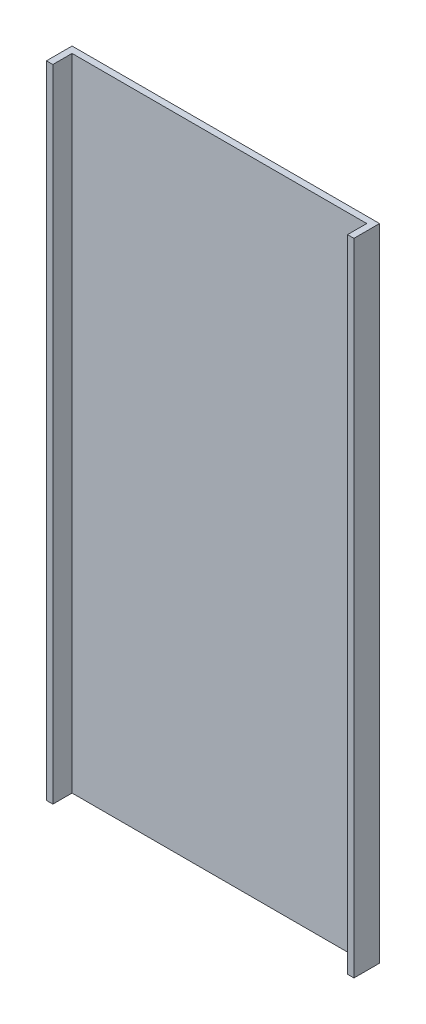
ISO-10303-21;
HEADER;
FILE_DESCRIPTION(('STEP AP214'),'2;1');
FILE_NAME('part.step','',(''),(''),'','','');
FILE_SCHEMA(('AUTOMOTIVE_DESIGN { 1 0 10303 214 1 1 1 1 }'));
ENDSEC;
DATA;
#1=APPLICATION_CONTEXT('core data for automotive mechanical design processes');
#2=APPLICATION_PROTOCOL_DEFINITION('international standard','automotive_design',2000,#1);
#3=PRODUCT_CONTEXT('',#1,'mechanical');
#4=PRODUCT('Part','Part','',(#3));
#5=PRODUCT_RELATED_PRODUCT_CATEGORY('part','',(#4));
#6=PRODUCT_DEFINITION_FORMATION('','',#4);
#7=PRODUCT_DEFINITION_CONTEXT('part definition',#1,'design');
#8=PRODUCT_DEFINITION('design','',#6,#7);
#9=PRODUCT_DEFINITION_SHAPE('','',#8);
#10=(LENGTH_UNIT() NAMED_UNIT(*) SI_UNIT(.MILLI.,.METRE.));
#11=(NAMED_UNIT(*) PLANE_ANGLE_UNIT() SI_UNIT($,.RADIAN.));
#12=(NAMED_UNIT(*) SI_UNIT($,.STERADIAN.) SOLID_ANGLE_UNIT());
#13=UNCERTAINTY_MEASURE_WITH_UNIT(LENGTH_MEASURE(1.E-05),#10,'distance_accuracy_value','');
#14=(GEOMETRIC_REPRESENTATION_CONTEXT(3) GLOBAL_UNCERTAINTY_ASSIGNED_CONTEXT((#13)) GLOBAL_UNIT_ASSIGNED_CONTEXT((#10,
#11,#12)) REPRESENTATION_CONTEXT('',''));
#15=CARTESIAN_POINT('',(0.,0.,0.));
#16=DIRECTION('',(0.,0.,1.));
#17=DIRECTION('',(1.,0.,0.));
#18=AXIS2_PLACEMENT_3D('',#15,#16,#17);
#19=CARTESIAN_POINT('',(0.,1000.,-40.));
#20=DIRECTION('',(1.,0.,0.));
#21=DIRECTION('',(0.,0.,-1.));
#22=AXIS2_PLACEMENT_3D('',#19,#20,#21);
#23=PLANE('',#22);
#24=DIRECTION('',(0.,0.,1.));
#25=VECTOR('',#24,1.);
#26=CARTESIAN_POINT('',(0.,0.,-40.));
#27=LINE('',#26,#25);
#28=CARTESIAN_POINT('',(0.,0.,-40.));
#29=VERTEX_POINT('',#28);
#30=CARTESIAN_POINT('',(0.,0.,0.));
#31=VERTEX_POINT('',#30);
#32=EDGE_CURVE('E140',#29,#31,#27,.T.);
#33=ORIENTED_EDGE('',*,*,#32,.T.);
#34=DIRECTION('',(0.,-1.,0.));
#35=VECTOR('',#34,1.);
#36=CARTESIAN_POINT('',(0.,1000.,0.));
#37=LINE('',#36,#35);
#38=CARTESIAN_POINT('',(0.,1000.,0.));
#39=VERTEX_POINT('',#38);
#40=EDGE_CURVE('E11',#39,#31,#37,.T.);
#41=ORIENTED_EDGE('',*,*,#40,.F.);
#42=DIRECTION('',(0.,0.,1.));
#43=VECTOR('',#42,1.);
#44=CARTESIAN_POINT('',(0.,1000.,-40.));
#45=LINE('',#44,#43);
#46=CARTESIAN_POINT('',(0.,1000.,-40.));
#47=VERTEX_POINT('',#46);
#48=EDGE_CURVE('E162',#47,#39,#45,.T.);
#49=ORIENTED_EDGE('',*,*,#48,.F.);
#50=DIRECTION('',(0.,-1.,0.));
#51=VECTOR('',#50,1.);
#52=CARTESIAN_POINT('',(0.,1000.,-40.));
#53=LINE('',#52,#51);
#54=EDGE_CURVE('E136',#47,#29,#53,.T.);
#55=ORIENTED_EDGE('',*,*,#54,.T.);
#56=EDGE_LOOP('',(#33,#41,#49,#55));
#57=FACE_BOUND('',#56,.T.);
#58=ADVANCED_FACE('F39',(#57),#23,.F.);
#59=CARTESIAN_POINT('',(0.,1000.,0.));
#60=DIRECTION('',(0.,0.,-1.));
#61=DIRECTION('',(-1.,0.,0.));
#62=AXIS2_PLACEMENT_3D('',#59,#60,#61);
#63=PLANE('',#62);
#64=DIRECTION('',(1.,0.,0.));
#65=VECTOR('',#64,1.);
#66=CARTESIAN_POINT('',(0.,0.,0.));
#67=LINE('',#66,#65);
#68=CARTESIAN_POINT('',(10.,0.,0.));
#69=VERTEX_POINT('',#68);
#70=EDGE_CURVE('E144',#31,#69,#67,.T.);
#71=ORIENTED_EDGE('',*,*,#70,.T.);
#72=DIRECTION('',(0.,-1.,0.));
#73=VECTOR('',#72,1.);
#74=CARTESIAN_POINT('',(10.,1000.,0.));
#75=LINE('',#74,#73);
#76=CARTESIAN_POINT('',(10.,1000.,0.));
#77=VERTEX_POINT('',#76);
#78=EDGE_CURVE('E48',#77,#69,#75,.T.);
#79=ORIENTED_EDGE('',*,*,#78,.F.);
#80=DIRECTION('',(1.,0.,0.));
#81=VECTOR('',#80,1.);
#82=CARTESIAN_POINT('',(0.,1000.,0.));
#83=LINE('',#82,#81);
#84=EDGE_CURVE('E99',#39,#77,#83,.T.);
#85=ORIENTED_EDGE('',*,*,#84,.F.);
#86=ORIENTED_EDGE('',*,*,#40,.T.);
#87=EDGE_LOOP('',(#71,#79,#85,#86));
#88=FACE_BOUND('',#87,.T.);
#89=ADVANCED_FACE('F208',(#88),#63,.F.);
#90=CARTESIAN_POINT('',(10.,1000.,0.));
#91=DIRECTION('',(-1.,0.,0.));
#92=DIRECTION('',(0.,0.,1.));
#93=AXIS2_PLACEMENT_3D('',#90,#91,#92);
#94=PLANE('',#93);
#95=DIRECTION('',(0.,0.,-1.));
#96=VECTOR('',#95,1.);
#97=CARTESIAN_POINT('',(10.,0.,0.));
#98=LINE('',#97,#96);
#99=CARTESIAN_POINT('',(10.,0.,-30.));
#100=VERTEX_POINT('',#99);
#101=EDGE_CURVE('E147',#69,#100,#98,.T.);
#102=ORIENTED_EDGE('',*,*,#101,.T.);
#103=DIRECTION('',(0.,-1.,0.));
#104=VECTOR('',#103,1.);
#105=CARTESIAN_POINT('',(10.,1000.,-30.));
#106=LINE('',#105,#104);
#107=CARTESIAN_POINT('',(10.,1000.,-30.));
#108=VERTEX_POINT('',#107);
#109=EDGE_CURVE('E173',#108,#100,#106,.T.);
#110=ORIENTED_EDGE('',*,*,#109,.F.);
#111=DIRECTION('',(0.,0.,-1.));
#112=VECTOR('',#111,1.);
#113=CARTESIAN_POINT('',(10.,1000.,0.));
#114=LINE('',#113,#112);
#115=EDGE_CURVE('E183',#77,#108,#114,.T.);
#116=ORIENTED_EDGE('',*,*,#115,.F.);
#117=ORIENTED_EDGE('',*,*,#78,.T.);
#118=EDGE_LOOP('',(#102,#110,#116,#117));
#119=FACE_BOUND('',#118,.T.);
#120=ADVANCED_FACE('F181',(#119),#94,.F.);
#121=CARTESIAN_POINT('',(10.,1000.,-30.));
#122=DIRECTION('',(0.,0.,-1.));
#123=DIRECTION('',(-1.,0.,0.));
#124=AXIS2_PLACEMENT_3D('',#121,#122,#123);
#125=PLANE('',#124);
#126=DIRECTION('',(1.,0.,0.));
#127=VECTOR('',#126,1.);
#128=CARTESIAN_POINT('',(10.,0.,-30.));
#129=LINE('',#128,#127);
#130=CARTESIAN_POINT('',(470.,0.,-30.));
#131=VERTEX_POINT('',#130);
#132=EDGE_CURVE('E150',#100,#131,#129,.T.);
#133=ORIENTED_EDGE('',*,*,#132,.T.);
#134=DIRECTION('',(0.,-1.,0.));
#135=VECTOR('',#134,1.);
#136=CARTESIAN_POINT('',(470.,1000.,-30.));
#137=LINE('',#136,#135);
#138=CARTESIAN_POINT('',(470.,1000.,-30.));
#139=VERTEX_POINT('',#138);
#140=EDGE_CURVE('E169',#139,#131,#137,.T.);
#141=ORIENTED_EDGE('',*,*,#140,.F.);
#142=DIRECTION('',(1.,0.,0.));
#143=VECTOR('',#142,1.);
#144=CARTESIAN_POINT('',(10.,1000.,-30.));
#145=LINE('',#144,#143);
#146=EDGE_CURVE('E196',#108,#139,#145,.T.);
#147=ORIENTED_EDGE('',*,*,#146,.F.);
#148=ORIENTED_EDGE('',*,*,#109,.T.);
#149=EDGE_LOOP('',(#133,#141,#147,#148));
#150=FACE_BOUND('',#149,.T.);
#151=ADVANCED_FACE('F191',(#150),#125,.F.);
#152=CARTESIAN_POINT('',(470.,1000.,-30.));
#153=DIRECTION('',(1.,0.,0.));
#154=DIRECTION('',(0.,0.,-1.));
#155=AXIS2_PLACEMENT_3D('',#152,#153,#154);
#156=PLANE('',#155);
#157=DIRECTION('',(0.,0.,1.));
#158=VECTOR('',#157,1.);
#159=CARTESIAN_POINT('',(470.,0.,-30.));
#160=LINE('',#159,#158);
#161=CARTESIAN_POINT('',(470.,0.,0.));
#162=VERTEX_POINT('',#161);
#163=EDGE_CURVE('E153',#131,#162,#160,.T.);
#164=ORIENTED_EDGE('',*,*,#163,.T.);
#165=DIRECTION('',(0.,-1.,0.));
#166=VECTOR('',#165,1.);
#167=CARTESIAN_POINT('',(470.,1000.,0.));
#168=LINE('',#167,#166);
#169=CARTESIAN_POINT('',(470.,1000.,0.));
#170=VERTEX_POINT('',#169);
#171=EDGE_CURVE('E129',#170,#162,#168,.T.);
#172=ORIENTED_EDGE('',*,*,#171,.F.);
#173=DIRECTION('',(0.,0.,1.));
#174=VECTOR('',#173,1.);
#175=CARTESIAN_POINT('',(470.,1000.,-30.));
#176=LINE('',#175,#174);
#177=EDGE_CURVE('E118',#139,#170,#176,.T.);
#178=ORIENTED_EDGE('',*,*,#177,.F.);
#179=ORIENTED_EDGE('',*,*,#140,.T.);
#180=EDGE_LOOP('',(#164,#172,#178,#179));
#181=FACE_BOUND('',#180,.T.);
#182=ADVANCED_FACE('F194',(#181),#156,.F.);
#183=CARTESIAN_POINT('',(470.,1000.,0.));
#184=DIRECTION('',(0.,0.,-1.));
#185=DIRECTION('',(-1.,0.,0.));
#186=AXIS2_PLACEMENT_3D('',#183,#184,#185);
#187=PLANE('',#186);
#188=DIRECTION('',(1.,0.,0.));
#189=VECTOR('',#188,1.);
#190=CARTESIAN_POINT('',(470.,0.,0.));
#191=LINE('',#190,#189);
#192=CARTESIAN_POINT('',(480.,0.,0.));
#193=VERTEX_POINT('',#192);
#194=EDGE_CURVE('E127',#162,#193,#191,.T.);
#195=ORIENTED_EDGE('',*,*,#194,.T.);
#196=DIRECTION('',(0.,-1.,0.));
#197=VECTOR('',#196,1.);
#198=CARTESIAN_POINT('',(480.,1000.,0.));
#199=LINE('',#198,#197);
#200=CARTESIAN_POINT('',(480.,1000.,0.));
#201=VERTEX_POINT('',#200);
#202=EDGE_CURVE('E124',#201,#193,#199,.T.);
#203=ORIENTED_EDGE('',*,*,#202,.F.);
#204=DIRECTION('',(1.,0.,0.));
#205=VECTOR('',#204,1.);
#206=CARTESIAN_POINT('',(470.,1000.,0.));
#207=LINE('',#206,#205);
#208=EDGE_CURVE('E112',#170,#201,#207,.T.);
#209=ORIENTED_EDGE('',*,*,#208,.F.);
#210=ORIENTED_EDGE('',*,*,#171,.T.);
#211=EDGE_LOOP('',(#195,#203,#209,#210));
#212=FACE_BOUND('',#211,.T.);
#213=ADVANCED_FACE('F125',(#212),#187,.F.);
#214=CARTESIAN_POINT('',(480.,1000.,0.));
#215=DIRECTION('',(-1.,0.,0.));
#216=DIRECTION('',(0.,0.,1.));
#217=AXIS2_PLACEMENT_3D('',#214,#215,#216);
#218=PLANE('',#217);
#219=DIRECTION('',(0.,0.,-1.));
#220=VECTOR('',#219,1.);
#221=CARTESIAN_POINT('',(480.,0.,0.));
#222=LINE('',#221,#220);
#223=CARTESIAN_POINT('',(480.,0.,-40.));
#224=VERTEX_POINT('',#223);
#225=EDGE_CURVE('E85',#193,#224,#222,.T.);
#226=ORIENTED_EDGE('',*,*,#225,.T.);
#227=DIRECTION('',(0.,-1.,0.));
#228=VECTOR('',#227,1.);
#229=CARTESIAN_POINT('',(480.,1000.,-40.));
#230=LINE('',#229,#228);
#231=CARTESIAN_POINT('',(480.,1000.,-40.));
#232=VERTEX_POINT('',#231);
#233=EDGE_CURVE('E130',#232,#224,#230,.T.);
#234=ORIENTED_EDGE('',*,*,#233,.F.);
#235=DIRECTION('',(0.,0.,-1.));
#236=VECTOR('',#235,1.);
#237=CARTESIAN_POINT('',(480.,1000.,0.));
#238=LINE('',#237,#236);
#239=EDGE_CURVE('E116',#201,#232,#238,.T.);
#240=ORIENTED_EDGE('',*,*,#239,.F.);
#241=ORIENTED_EDGE('',*,*,#202,.T.);
#242=EDGE_LOOP('',(#226,#234,#240,#241));
#243=FACE_BOUND('',#242,.T.);
#244=ADVANCED_FACE('F132',(#243),#218,.F.);
#245=CARTESIAN_POINT('',(480.,1000.,-40.));
#246=DIRECTION('',(0.,0.,1.));
#247=DIRECTION('',(1.,0.,0.));
#248=AXIS2_PLACEMENT_3D('',#245,#246,#247);
#249=PLANE('',#248);
#250=DIRECTION('',(-1.,0.,0.));
#251=VECTOR('',#250,1.);
#252=CARTESIAN_POINT('',(480.,0.,-40.));
#253=LINE('',#252,#251);
#254=EDGE_CURVE('E91',#224,#29,#253,.T.);
#255=ORIENTED_EDGE('',*,*,#254,.T.);
#256=ORIENTED_EDGE('',*,*,#54,.F.);
#257=DIRECTION('',(-1.,0.,0.));
#258=VECTOR('',#257,1.);
#259=CARTESIAN_POINT('',(480.,1000.,-40.));
#260=LINE('',#259,#258);
#261=EDGE_CURVE('E56',#232,#47,#260,.T.);
#262=ORIENTED_EDGE('',*,*,#261,.F.);
#263=ORIENTED_EDGE('',*,*,#233,.T.);
#264=EDGE_LOOP('',(#255,#256,#262,#263));
#265=FACE_BOUND('',#264,.T.);
#266=ADVANCED_FACE('F224',(#265),#249,.F.);
#267=CARTESIAN_POINT('',(0.,1000.,0.));
#268=DIRECTION('',(0.,1.,0.));
#269=DIRECTION('',(0.,0.,1.));
#270=AXIS2_PLACEMENT_3D('',#267,#268,#269);
#271=PLANE('',#270);
#272=ORIENTED_EDGE('',*,*,#48,.T.);
#273=ORIENTED_EDGE('',*,*,#84,.T.);
#274=ORIENTED_EDGE('',*,*,#115,.T.);
#275=ORIENTED_EDGE('',*,*,#146,.T.);
#276=ORIENTED_EDGE('',*,*,#177,.T.);
#277=ORIENTED_EDGE('',*,*,#208,.T.);
#278=ORIENTED_EDGE('',*,*,#239,.T.);
#279=ORIENTED_EDGE('',*,*,#261,.T.);
#280=EDGE_LOOP('',(#272,#273,#274,#275,#276,#277,#278,#279));
#281=FACE_BOUND('',#280,.T.);
#282=ADVANCED_FACE('F114',(#281),#271,.T.);
#283=CARTESIAN_POINT('',(0.,0.,0.));
#284=DIRECTION('',(0.,1.,0.));
#285=DIRECTION('',(0.,0.,1.));
#286=AXIS2_PLACEMENT_3D('',#283,#284,#285);
#287=PLANE('',#286);
#288=ORIENTED_EDGE('',*,*,#32,.F.);
#289=ORIENTED_EDGE('',*,*,#254,.F.);
#290=ORIENTED_EDGE('',*,*,#225,.F.);
#291=ORIENTED_EDGE('',*,*,#194,.F.);
#292=ORIENTED_EDGE('',*,*,#163,.F.);
#293=ORIENTED_EDGE('',*,*,#132,.F.);
#294=ORIENTED_EDGE('',*,*,#101,.F.);
#295=ORIENTED_EDGE('',*,*,#70,.F.);
#296=EDGE_LOOP('',(#288,#289,#290,#291,#292,#293,#294,#295));
#297=FACE_BOUND('',#296,.T.);
#298=ADVANCED_FACE('F187',(#297),#287,.F.);
#299=CLOSED_SHELL('',(#58,#89,#120,#151,#182,#213,#244,#266,#282,#298));
#300=MANIFOLD_SOLID_BREP('B2',#299);
#301=ADVANCED_BREP_SHAPE_REPRESENTATION('',(#18,#300),#14);
#302=SHAPE_DEFINITION_REPRESENTATION(#9,#301);
ENDSEC;
END-ISO-10303-21;
